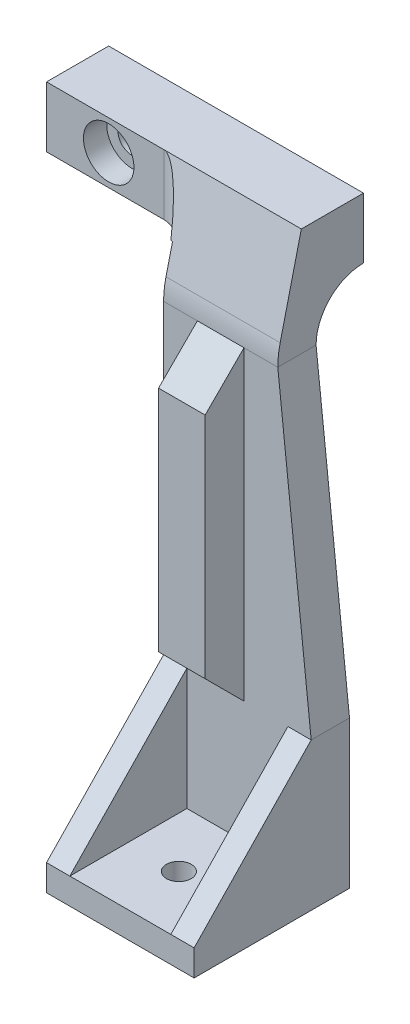
ISO-10303-21;
HEADER;
FILE_DESCRIPTION(('STEP AP214'),'2;1');
FILE_NAME('part.step','',(''),(''),'','','');
FILE_SCHEMA(('AUTOMOTIVE_DESIGN { 1 0 10303 214 1 1 1 1 }'));
ENDSEC;
DATA;
#1=APPLICATION_CONTEXT('core data for automotive mechanical design processes');
#2=APPLICATION_PROTOCOL_DEFINITION('international standard','automotive_design',2000,#1);
#3=PRODUCT_CONTEXT('',#1,'mechanical');
#4=PRODUCT('Part','Part','',(#3));
#5=PRODUCT_RELATED_PRODUCT_CATEGORY('part','',(#4));
#6=PRODUCT_DEFINITION_FORMATION('','',#4);
#7=PRODUCT_DEFINITION_CONTEXT('part definition',#1,'design');
#8=PRODUCT_DEFINITION('design','',#6,#7);
#9=PRODUCT_DEFINITION_SHAPE('','',#8);
#10=(LENGTH_UNIT() NAMED_UNIT(*) SI_UNIT(.MILLI.,.METRE.));
#11=(NAMED_UNIT(*) PLANE_ANGLE_UNIT() SI_UNIT($,.RADIAN.));
#12=(NAMED_UNIT(*) SI_UNIT($,.STERADIAN.) SOLID_ANGLE_UNIT());
#13=UNCERTAINTY_MEASURE_WITH_UNIT(LENGTH_MEASURE(1.E-05),#10,'distance_accuracy_value','');
#14=(GEOMETRIC_REPRESENTATION_CONTEXT(3) GLOBAL_UNCERTAINTY_ASSIGNED_CONTEXT((#13)) GLOBAL_UNIT_ASSIGNED_CONTEXT((#10,
#11,#12)) REPRESENTATION_CONTEXT('',''));
#15=CARTESIAN_POINT('',(0.,0.,0.));
#16=DIRECTION('',(0.,0.,1.));
#17=DIRECTION('',(1.,0.,0.));
#18=AXIS2_PLACEMENT_3D('',#15,#16,#17);
#19=CARTESIAN_POINT('',(-24.8,10.,-6.1));
#20=DIRECTION('',(0.,0.,1.));
#21=DIRECTION('',(1.,0.,0.));
#22=AXIS2_PLACEMENT_3D('',#19,#20,#21);
#23=CYLINDRICAL_SURFACE('',#22,1.8);
#24=CARTESIAN_POINT('',(-24.8,10.,-6.1));
#25=DIRECTION('',(0.,0.,1.));
#26=DIRECTION('',(1.,0.,0.));
#27=AXIS2_PLACEMENT_3D('',#24,#25,#26);
#28=CIRCLE('',#27,1.8);
#29=CARTESIAN_POINT('',(-23.,10.,-6.1));
#30=VERTEX_POINT('',#29);
#31=EDGE_CURVE('E746',#30,#30,#28,.T.);
#32=ORIENTED_EDGE('',*,*,#31,.F.);
#33=EDGE_LOOP('',(#32));
#34=FACE_BOUND('',#33,.T.);
#35=CARTESIAN_POINT('',(-24.8,10.,-1.1));
#36=DIRECTION('',(0.,0.,1.));
#37=DIRECTION('',(1.,0.,0.));
#38=AXIS2_PLACEMENT_3D('',#35,#36,#37);
#39=CIRCLE('',#38,1.8);
#40=CARTESIAN_POINT('',(-23.,10.,-1.1));
#41=VERTEX_POINT('',#40);
#42=EDGE_CURVE('E76',#41,#41,#39,.F.);
#43=ORIENTED_EDGE('',*,*,#42,.F.);
#44=EDGE_LOOP('',(#43));
#45=FACE_BOUND('',#44,.T.);
#46=ADVANCED_FACE('F72',(#34,#45),#23,.F.);
#47=CARTESIAN_POINT('',(0.,0.,1.9));
#48=DIRECTION('',(0.,0.,1.));
#49=DIRECTION('',(1.,0.,0.));
#50=AXIS2_PLACEMENT_3D('',#47,#48,#49);
#51=PLANE('',#50);
#52=CARTESIAN_POINT('',(-24.8,10.,1.9));
#53=DIRECTION('',(0.,0.,1.));
#54=DIRECTION('',(1.,0.,0.));
#55=AXIS2_PLACEMENT_3D('',#52,#53,#54);
#56=CIRCLE('',#55,3.25);
#57=CARTESIAN_POINT('',(-21.55,10.,1.9));
#58=VERTEX_POINT('',#57);
#59=EDGE_CURVE('E742',#58,#58,#56,.T.);
#60=ORIENTED_EDGE('',*,*,#59,.F.);
#61=EDGE_LOOP('',(#60));
#62=FACE_BOUND('',#61,.T.);
#63=DIRECTION('',(-1.,0.,0.));
#64=VECTOR('',#63,1.);
#65=CARTESIAN_POINT('',(0.,6.1,1.9));
#66=LINE('',#65,#64);
#67=CARTESIAN_POINT('',(-17.7,6.1,1.9));
#68=VERTEX_POINT('',#67);
#69=CARTESIAN_POINT('',(-32.8,6.1,1.9));
#70=VERTEX_POINT('',#69);
#71=EDGE_CURVE('E306',#68,#70,#66,.T.);
#72=ORIENTED_EDGE('',*,*,#71,.F.);
#73=DIRECTION('',(0.,-1.,0.));
#74=VECTOR('',#73,1.);
#75=CARTESIAN_POINT('',(-17.7,0.,1.9));
#76=LINE('',#75,#74);
#77=CARTESIAN_POINT('',(-17.7,13.9,1.9));
#78=VERTEX_POINT('',#77);
#79=EDGE_CURVE('E289',#68,#78,#76,.F.);
#80=ORIENTED_EDGE('',*,*,#79,.T.);
#81=DIRECTION('',(1.,0.,0.));
#82=VECTOR('',#81,1.);
#83=CARTESIAN_POINT('',(0.,13.9,1.9));
#84=LINE('',#83,#82);
#85=CARTESIAN_POINT('',(-32.8,13.9,1.9));
#86=VERTEX_POINT('',#85);
#87=EDGE_CURVE('E304',#86,#78,#84,.T.);
#88=ORIENTED_EDGE('',*,*,#87,.F.);
#89=DIRECTION('',(0.,1.,0.));
#90=VECTOR('',#89,1.);
#91=CARTESIAN_POINT('',(-32.8,6.1,1.9));
#92=LINE('',#91,#90);
#93=EDGE_CURVE('E320',#70,#86,#92,.T.);
#94=ORIENTED_EDGE('',*,*,#93,.F.);
#95=EDGE_LOOP('',(#72,#80,#88,#94));
#96=FACE_BOUND('',#95,.T.);
#97=ADVANCED_FACE('F303',(#62,#96),#51,.T.);
#98=CARTESIAN_POINT('',(-14.7,0.,4.93));
#99=DIRECTION('',(1.,0.,0.));
#100=DIRECTION('',(0.,0.,-1.));
#101=AXIS2_PLACEMENT_3D('',#98,#99,#100);
#102=PLANE('',#101);
#103=DIRECTION('',(0.,-0.972246500148864,0.233958848835186));
#104=VECTOR('',#103,1.);
#105=CARTESIAN_POINT('',(-14.7,13.9,1.9));
#106=LINE('',#105,#104);
#107=CARTESIAN_POINT('',(-14.7,6.1,3.77697155056361));
#108=VERTEX_POINT('',#107);
#109=CARTESIAN_POINT('',(-14.7,2.5805661026521,4.62387889664197));
#110=VERTEX_POINT('',#109);
#111=EDGE_CURVE('E215',#108,#110,#106,.T.);
#112=ORIENTED_EDGE('',*,*,#111,.F.);
#113=DIRECTION('',(0.,0.,-1.));
#114=VECTOR('',#113,1.);
#115=CARTESIAN_POINT('',(-14.7,6.1,4.93));
#116=LINE('',#115,#114);
#117=CARTESIAN_POINT('',(-14.7,6.09999999999999,-6.1));
#118=VERTEX_POINT('',#117);
#119=EDGE_CURVE('E333',#108,#118,#116,.T.);
#120=ORIENTED_EDGE('',*,*,#119,.T.);
#121=CARTESIAN_POINT('',(-14.7,0.,-6.1));
#122=DIRECTION('',(1.,0.,0.));
#123=DIRECTION('',(0.,0.,1.));
#124=AXIS2_PLACEMENT_3D('',#121,#122,#123);
#125=CIRCLE('',#124,6.1);
#126=CARTESIAN_POINT('',(-14.7,0.,0.));
#127=VERTEX_POINT('',#126);
#128=EDGE_CURVE('E237',#118,#127,#125,.T.);
#129=ORIENTED_EDGE('',*,*,#128,.T.);
#130=DIRECTION('',(0.,-1.,0.));
#131=VECTOR('',#130,1.);
#132=CARTESIAN_POINT('',(-14.7,0.,0.));
#133=LINE('',#132,#131);
#134=CARTESIAN_POINT('',(-14.7,-58.4008189065249,0.));
#135=VERTEX_POINT('',#134);
#136=EDGE_CURVE('E263',#127,#135,#133,.T.);
#137=ORIENTED_EDGE('',*,*,#136,.T.);
#138=DIRECTION('',(0.,0.,1.));
#139=VECTOR('',#138,1.);
#140=CARTESIAN_POINT('',(-14.7,-58.4008189065249,0.));
#141=LINE('',#140,#139);
#142=CARTESIAN_POINT('',(-14.7,-58.4008189065249,20.));
#143=VERTEX_POINT('',#142);
#144=EDGE_CURVE('E294',#135,#143,#141,.T.);
#145=ORIENTED_EDGE('',*,*,#144,.T.);
#146=DIRECTION('',(0.,1.,0.));
#147=VECTOR('',#146,1.);
#148=CARTESIAN_POINT('',(-14.7,-61.4,20.));
#149=LINE('',#148,#147);
#150=CARTESIAN_POINT('',(-14.7,-55.04,20.));
#151=VERTEX_POINT('',#150);
#152=EDGE_CURVE('E394',#143,#151,#149,.T.);
#153=ORIENTED_EDGE('',*,*,#152,.T.);
#154=DIRECTION('',(0.,0.720107170789403,-0.693862855741451));
#155=VECTOR('',#154,1.);
#156=CARTESIAN_POINT('',(-14.7,-55.04,20.));
#157=LINE('',#156,#155);
#158=CARTESIAN_POINT('',(-14.7,-39.4,4.93));
#159=VERTEX_POINT('',#158);
#160=EDGE_CURVE('E387',#151,#159,#157,.T.);
#161=ORIENTED_EDGE('',*,*,#160,.T.);
#162=DIRECTION('',(0.,-1.,0.));
#163=VECTOR('',#162,1.);
#164=CARTESIAN_POINT('',(-14.7,0.,4.93));
#165=LINE('',#164,#163);
#166=CARTESIAN_POINT('',(-14.7,0.,4.93));
#167=VERTEX_POINT('',#166);
#168=EDGE_CURVE('E240',#167,#159,#165,.T.);
#169=ORIENTED_EDGE('',*,*,#168,.F.);
#170=CARTESIAN_POINT('',(-14.7,0.,-6.1));
#171=DIRECTION('',(-1.,0.,0.));
#172=DIRECTION('',(0.,0.,1.));
#173=AXIS2_PLACEMENT_3D('',#170,#171,#172);
#174=CIRCLE('',#173,11.03);
#175=EDGE_CURVE('E227',#167,#110,#174,.T.);
#176=ORIENTED_EDGE('',*,*,#175,.T.);
#177=EDGE_LOOP('',(#112,#120,#129,#137,#145,#153,#161,#169,#176));
#178=FACE_BOUND('',#177,.T.);
#179=ADVANCED_FACE('F234',(#178),#102,.F.);
#180=CARTESIAN_POINT('',(4.3,-39.4,4.93));
#181=DIRECTION('',(-1.,0.,0.));
#182=DIRECTION('',(0.,-1.,0.));
#183=AXIS2_PLACEMENT_3D('',#180,#181,#182);
#184=PLANE('',#183);
#185=DIRECTION('',(0.,0.,1.));
#186=VECTOR('',#185,1.);
#187=CARTESIAN_POINT('',(4.3,-58.4008189065249,0.));
#188=LINE('',#187,#186);
#189=CARTESIAN_POINT('',(4.3,-58.4008189065249,0.));
#190=VERTEX_POINT('',#189);
#191=CARTESIAN_POINT('',(4.3,-58.4008189065249,20.));
#192=VERTEX_POINT('',#191);
#193=EDGE_CURVE('E338',#190,#192,#188,.T.);
#194=ORIENTED_EDGE('',*,*,#193,.F.);
#195=DIRECTION('',(0.,1.,0.));
#196=VECTOR('',#195,1.);
#197=CARTESIAN_POINT('',(4.3,-39.4,0.));
#198=LINE('',#197,#196);
#199=CARTESIAN_POINT('',(4.3,-39.4,0.));
#200=VERTEX_POINT('',#199);
#201=EDGE_CURVE('E253',#190,#200,#198,.T.);
#202=ORIENTED_EDGE('',*,*,#201,.T.);
#203=DIRECTION('',(0.,0.,-1.));
#204=VECTOR('',#203,1.);
#205=CARTESIAN_POINT('',(4.3,-39.4,4.93));
#206=LINE('',#205,#204);
#207=CARTESIAN_POINT('',(4.3,-39.4,4.93));
#208=VERTEX_POINT('',#207);
#209=EDGE_CURVE('E256',#208,#200,#206,.T.);
#210=ORIENTED_EDGE('',*,*,#209,.F.);
#211=DIRECTION('',(0.,-0.720107170789403,0.693862855741451));
#212=VECTOR('',#211,1.);
#213=CARTESIAN_POINT('',(4.3,-55.04,20.));
#214=LINE('',#213,#212);
#215=CARTESIAN_POINT('',(4.3,-55.04,20.));
#216=VERTEX_POINT('',#215);
#217=EDGE_CURVE('E242',#208,#216,#214,.T.);
#218=ORIENTED_EDGE('',*,*,#217,.T.);
#219=DIRECTION('',(0.,-1.,0.));
#220=VECTOR('',#219,1.);
#221=CARTESIAN_POINT('',(4.3,-61.4,20.));
#222=LINE('',#221,#220);
#223=EDGE_CURVE('E390',#216,#192,#222,.T.);
#224=ORIENTED_EDGE('',*,*,#223,.T.);
#225=EDGE_LOOP('',(#194,#202,#210,#218,#224));
#226=FACE_BOUND('',#225,.T.);
#227=ADVANCED_FACE('F431',(#226),#184,.F.);
#228=CARTESIAN_POINT('',(0.,0.,0.));
#229=DIRECTION('',(0.,0.,-1.));
#230=DIRECTION('',(-1.,0.,0.));
#231=AXIS2_PLACEMENT_3D('',#228,#229,#230);
#232=PLANE('',#231);
#233=ORIENTED_EDGE('',*,*,#201,.F.);
#234=DIRECTION('',(-1.,0.,0.));
#235=VECTOR('',#234,1.);
#236=CARTESIAN_POINT('',(-14.7,-58.4008189065249,0.));
#237=LINE('',#236,#235);
#238=EDGE_CURVE('E340',#190,#135,#237,.T.);
#239=ORIENTED_EDGE('',*,*,#238,.T.);
#240=ORIENTED_EDGE('',*,*,#136,.F.);
#241=DIRECTION('',(-1.,0.,0.));
#242=VECTOR('',#241,1.);
#243=CARTESIAN_POINT('',(0.,0.,0.));
#244=LINE('',#243,#242);
#245=CARTESIAN_POINT('',(0.,0.,0.));
#246=VERTEX_POINT('',#245);
#247=EDGE_CURVE('E265',#246,#127,#244,.T.);
#248=ORIENTED_EDGE('',*,*,#247,.F.);
#249=DIRECTION('',(-0.108492844893712,0.99409722995634,0.));
#250=VECTOR('',#249,1.);
#251=CARTESIAN_POINT('',(0.,0.,0.));
#252=LINE('',#251,#250);
#253=EDGE_CURVE('E252',#200,#246,#252,.T.);
#254=ORIENTED_EDGE('',*,*,#253,.F.);
#255=EDGE_LOOP('',(#233,#239,#240,#248,#254));
#256=FACE_BOUND('',#255,.T.);
#257=ADVANCED_FACE('F437',(#256),#232,.T.);
#258=CARTESIAN_POINT('',(0.,0.,4.93));
#259=DIRECTION('',(0.,0.,-1.));
#260=DIRECTION('',(-1.,0.,0.));
#261=AXIS2_PLACEMENT_3D('',#258,#259,#260);
#262=PLANE('',#261);
#263=DIRECTION('',(0.,-1.,0.));
#264=VECTOR('',#263,1.);
#265=CARTESIAN_POINT('',(-10.35,0.,4.93));
#266=LINE('',#265,#264);
#267=CARTESIAN_POINT('',(-10.35,0.,4.93));
#268=VERTEX_POINT('',#267);
#269=CARTESIAN_POINT('',(-10.35,-39.4,4.93));
#270=VERTEX_POINT('',#269);
#271=EDGE_CURVE('E350',#268,#270,#266,.T.);
#272=ORIENTED_EDGE('',*,*,#271,.F.);
#273=DIRECTION('',(-1.,0.,0.));
#274=VECTOR('',#273,1.);
#275=CARTESIAN_POINT('',(0.,0.,4.93));
#276=LINE('',#275,#274);
#277=EDGE_CURVE('E251',#268,#167,#276,.T.);
#278=ORIENTED_EDGE('',*,*,#277,.T.);
#279=ORIENTED_EDGE('',*,*,#168,.T.);
#280=DIRECTION('',(-1.,0.,0.));
#281=VECTOR('',#280,1.);
#282=CARTESIAN_POINT('',(30.966550208079,-39.4,4.93));
#283=LINE('',#282,#281);
#284=CARTESIAN_POINT('',(-11.7,-39.4,4.93));
#285=VERTEX_POINT('',#284);
#286=EDGE_CURVE('E393',#285,#159,#283,.T.);
#287=ORIENTED_EDGE('',*,*,#286,.F.);
#288=DIRECTION('',(0.,-1.,0.));
#289=VECTOR('',#288,1.);
#290=CARTESIAN_POINT('',(-11.7,-39.4,4.93));
#291=LINE('',#290,#289);
#292=CARTESIAN_POINT('',(-11.7,-55.04,4.93));
#293=VERTEX_POINT('',#292);
#294=EDGE_CURVE('E372',#285,#293,#291,.T.);
#295=ORIENTED_EDGE('',*,*,#294,.T.);
#296=DIRECTION('',(1.,0.,0.));
#297=VECTOR('',#296,1.);
#298=CARTESIAN_POINT('',(-11.7,-55.04,4.93));
#299=LINE('',#298,#297);
#300=CARTESIAN_POINT('',(1.3,-55.04,4.93));
#301=VERTEX_POINT('',#300);
#302=EDGE_CURVE('E380',#293,#301,#299,.T.);
#303=ORIENTED_EDGE('',*,*,#302,.T.);
#304=DIRECTION('',(0.,1.,0.));
#305=VECTOR('',#304,1.);
#306=CARTESIAN_POINT('',(1.3,-39.4,4.93));
#307=LINE('',#306,#305);
#308=CARTESIAN_POINT('',(1.3,-39.4,4.93));
#309=VERTEX_POINT('',#308);
#310=EDGE_CURVE('E379',#301,#309,#307,.T.);
#311=ORIENTED_EDGE('',*,*,#310,.T.);
#312=EDGE_CURVE('E397',#208,#309,#283,.T.);
#313=ORIENTED_EDGE('',*,*,#312,.F.);
#314=DIRECTION('',(-0.108492844893712,0.99409722995634,0.));
#315=VECTOR('',#314,1.);
#316=CARTESIAN_POINT('',(0.,0.,4.93));
#317=LINE('',#316,#315);
#318=CARTESIAN_POINT('',(0.,0.,4.93));
#319=VERTEX_POINT('',#318);
#320=EDGE_CURVE('E255',#208,#319,#317,.T.);
#321=ORIENTED_EDGE('',*,*,#320,.T.);
#322=CARTESIAN_POINT('',(-4.35,0.,4.93));
#323=VERTEX_POINT('',#322);
#324=EDGE_CURVE('E257',#319,#323,#276,.T.);
#325=ORIENTED_EDGE('',*,*,#324,.T.);
#326=DIRECTION('',(0.,1.,0.));
#327=VECTOR('',#326,1.);
#328=CARTESIAN_POINT('',(-4.35000000000001,0.,4.93));
#329=LINE('',#328,#327);
#330=CARTESIAN_POINT('',(-4.34999999999999,-39.4,4.93));
#331=VERTEX_POINT('',#330);
#332=EDGE_CURVE('E363',#331,#323,#329,.T.);
#333=ORIENTED_EDGE('',*,*,#332,.F.);
#334=DIRECTION('',(1.,0.,0.));
#335=VECTOR('',#334,1.);
#336=CARTESIAN_POINT('',(-10.35,-39.4,4.93));
#337=LINE('',#336,#335);
#338=EDGE_CURVE('E356',#270,#331,#337,.T.);
#339=ORIENTED_EDGE('',*,*,#338,.F.);
#340=EDGE_LOOP('',(#272,#278,#279,#287,#295,#303,#311,#313,#321,#325,#333,#339));
#341=FACE_BOUND('',#340,.T.);
#342=ADVANCED_FACE('F414',(#341),#262,.F.);
#343=CARTESIAN_POINT('',(30.966550208079,-55.04,20.));
#344=DIRECTION('',(0.,0.693862855741451,0.720107170789403));
#345=DIRECTION('',(0.,-0.720107170789403,0.693862855741451));
#346=AXIS2_PLACEMENT_3D('',#343,#344,#345);
#347=PLANE('',#346);
#348=DIRECTION('',(0.,-0.720107170789403,0.693862855741451));
#349=VECTOR('',#348,1.);
#350=CARTESIAN_POINT('',(-11.7,-46.9303098183329,12.1858675807082));
#351=LINE('',#350,#349);
#352=CARTESIAN_POINT('',(-11.7,-55.04,20.));
#353=VERTEX_POINT('',#352);
#354=EDGE_CURVE('E371',#285,#353,#351,.T.);
#355=ORIENTED_EDGE('',*,*,#354,.F.);
#356=ORIENTED_EDGE('',*,*,#286,.T.);
#357=ORIENTED_EDGE('',*,*,#160,.F.);
#358=DIRECTION('',(-1.,0.,0.));
#359=VECTOR('',#358,1.);
#360=CARTESIAN_POINT('',(30.966550208079,-55.04,20.));
#361=LINE('',#360,#359);
#362=EDGE_CURVE('E398',#353,#151,#361,.T.);
#363=ORIENTED_EDGE('',*,*,#362,.F.);
#364=EDGE_LOOP('',(#355,#356,#357,#363));
#365=FACE_BOUND('',#364,.T.);
#366=ADVANCED_FACE('F409',(#365),#347,.T.);
#367=CARTESIAN_POINT('',(0.,0.,4.93));
#368=DIRECTION('',(-0.99409722995634,-0.108492844893712,0.));
#369=DIRECTION('',(0.108492844893712,-0.99409722995634,0.));
#370=AXIS2_PLACEMENT_3D('',#367,#368,#369);
#371=PLANE('',#370);
#372=ORIENTED_EDGE('',*,*,#253,.T.);
#373=DIRECTION('',(0.,0.,-1.));
#374=VECTOR('',#373,1.);
#375=CARTESIAN_POINT('',(0.,0.,4.93));
#376=LINE('',#375,#374);
#377=EDGE_CURVE('E272',#319,#246,#376,.T.);
#378=ORIENTED_EDGE('',*,*,#377,.F.);
#379=ORIENTED_EDGE('',*,*,#320,.F.);
#380=ORIENTED_EDGE('',*,*,#209,.T.);
#381=EDGE_LOOP('',(#372,#378,#379,#380));
#382=FACE_BOUND('',#381,.T.);
#383=ADVANCED_FACE('F442',(#382),#371,.F.);
#384=CARTESIAN_POINT('',(0.,0.,-6.1));
#385=DIRECTION('',(-1.,0.,0.));
#386=DIRECTION('',(0.,0.,1.));
#387=AXIS2_PLACEMENT_3D('',#384,#385,#386);
#388=CYLINDRICAL_SURFACE('',#387,6.1);
#389=ORIENTED_EDGE('',*,*,#128,.F.);
#390=DIRECTION('',(-1.,0.,0.));
#391=VECTOR('',#390,1.);
#392=CARTESIAN_POINT('',(0.,6.1,-6.1));
#393=LINE('',#392,#391);
#394=CARTESIAN_POINT('',(0.,6.1,-6.1));
#395=VERTEX_POINT('',#394);
#396=EDGE_CURVE('E247',#395,#118,#393,.T.);
#397=ORIENTED_EDGE('',*,*,#396,.F.);
#398=CARTESIAN_POINT('',(0.,0.,-6.1));
#399=DIRECTION('',(1.,0.,0.));
#400=DIRECTION('',(0.,0.,1.));
#401=AXIS2_PLACEMENT_3D('',#398,#399,#400);
#402=CIRCLE('',#401,6.1);
#403=EDGE_CURVE('E238',#395,#246,#402,.T.);
#404=ORIENTED_EDGE('',*,*,#403,.T.);
#405=ORIENTED_EDGE('',*,*,#247,.T.);
#406=EDGE_LOOP('',(#389,#397,#404,#405));
#407=FACE_BOUND('',#406,.T.);
#408=ADVANCED_FACE('F581',(#407),#388,.F.);
#409=CARTESIAN_POINT('',(0.,0.,-6.1));
#410=DIRECTION('',(-1.,0.,0.));
#411=DIRECTION('',(0.,0.,1.));
#412=AXIS2_PLACEMENT_3D('',#409,#410,#411);
#413=CYLINDRICAL_SURFACE('',#412,11.03);
#414=DIRECTION('',(1.,0.,0.));
#415=VECTOR('',#414,1.);
#416=CARTESIAN_POINT('',(-14.7,2.5805661026521,4.62387889664197));
#417=LINE('',#416,#415);
#418=CARTESIAN_POINT('',(0.,2.5805661026521,4.62387889664197));
#419=VERTEX_POINT('',#418);
#420=EDGE_CURVE('E211',#110,#419,#417,.T.);
#421=ORIENTED_EDGE('',*,*,#420,.F.);
#422=ORIENTED_EDGE('',*,*,#175,.F.);
#423=ORIENTED_EDGE('',*,*,#277,.F.);
#424=DIRECTION('',(-1.,0.,0.));
#425=VECTOR('',#424,1.);
#426=CARTESIAN_POINT('',(-10.35,0.,4.93));
#427=LINE('',#426,#425);
#428=EDGE_CURVE('E355',#323,#268,#427,.T.);
#429=ORIENTED_EDGE('',*,*,#428,.F.);
#430=ORIENTED_EDGE('',*,*,#324,.F.);
#431=CARTESIAN_POINT('',(0.,0.,-6.1));
#432=DIRECTION('',(-1.,0.,0.));
#433=DIRECTION('',(0.,0.,1.));
#434=AXIS2_PLACEMENT_3D('',#431,#432,#433);
#435=CIRCLE('',#434,11.03);
#436=EDGE_CURVE('E229',#319,#419,#435,.T.);
#437=ORIENTED_EDGE('',*,*,#436,.T.);
#438=EDGE_LOOP('',(#421,#422,#423,#429,#430,#437));
#439=FACE_BOUND('',#438,.T.);
#440=ADVANCED_FACE('F224',(#439),#413,.T.);
#441=CARTESIAN_POINT('',(0.,0.,-6.1));
#442=DIRECTION('',(-1.,0.,0.));
#443=DIRECTION('',(0.,0.,1.));
#444=AXIS2_PLACEMENT_3D('',#441,#442,#443);
#445=PLANE('',#444);
#446=DIRECTION('',(0.,1.,0.));
#447=VECTOR('',#446,1.);
#448=CARTESIAN_POINT('',(0.,0.,-6.1));
#449=LINE('',#448,#447);
#450=CARTESIAN_POINT('',(0.,13.9,-6.1));
#451=VERTEX_POINT('',#450);
#452=EDGE_CURVE('E288',#395,#451,#449,.T.);
#453=ORIENTED_EDGE('',*,*,#452,.T.);
#454=DIRECTION('',(0.,0.,-1.));
#455=VECTOR('',#454,1.);
#456=CARTESIAN_POINT('',(0.,13.9,1.9));
#457=LINE('',#456,#455);
#458=CARTESIAN_POINT('',(0.,13.9,1.9));
#459=VERTEX_POINT('',#458);
#460=EDGE_CURVE('E331',#459,#451,#457,.T.);
#461=ORIENTED_EDGE('',*,*,#460,.F.);
#462=DIRECTION('',(0.,-0.972246500148864,0.233958848835186));
#463=VECTOR('',#462,1.);
#464=CARTESIAN_POINT('',(0.,13.9,1.9));
#465=LINE('',#464,#463);
#466=EDGE_CURVE('E218',#459,#419,#465,.T.);
#467=ORIENTED_EDGE('',*,*,#466,.T.);
#468=ORIENTED_EDGE('',*,*,#436,.F.);
#469=ORIENTED_EDGE('',*,*,#377,.T.);
#470=ORIENTED_EDGE('',*,*,#403,.F.);
#471=EDGE_LOOP('',(#453,#461,#467,#468,#469,#470));
#472=FACE_BOUND('',#471,.T.);
#473=ADVANCED_FACE('F601',(#472),#445,.F.);
#474=DIRECTION('',(0.,0.720107170789403,-0.693862855741451));
#475=VECTOR('',#474,1.);
#476=CARTESIAN_POINT('',(1.3,-46.9303098183329,12.1858675807082));
#477=LINE('',#476,#475);
#478=CARTESIAN_POINT('',(1.3,-55.04,20.));
#479=VERTEX_POINT('',#478);
#480=EDGE_CURVE('E368',#479,#309,#477,.T.);
#481=ORIENTED_EDGE('',*,*,#480,.F.);
#482=EDGE_CURVE('E386',#216,#479,#361,.T.);
#483=ORIENTED_EDGE('',*,*,#482,.F.);
#484=ORIENTED_EDGE('',*,*,#217,.F.);
#485=ORIENTED_EDGE('',*,*,#312,.T.);
#486=EDGE_LOOP('',(#481,#483,#484,#485));
#487=FACE_BOUND('',#486,.T.);
#488=ADVANCED_FACE('F430',(#487),#347,.T.);
#489=CARTESIAN_POINT('',(30.966550208079,-61.4,20.));
#490=DIRECTION('',(0.,0.,1.));
#491=DIRECTION('',(1.,0.,0.));
#492=AXIS2_PLACEMENT_3D('',#489,#490,#491);
#493=PLANE('',#492);
#494=DIRECTION('',(-1.,0.,0.));
#495=VECTOR('',#494,1.);
#496=CARTESIAN_POINT('',(-14.7,-58.4008189065249,20.));
#497=LINE('',#496,#495);
#498=EDGE_CURVE('E337',#192,#143,#497,.T.);
#499=ORIENTED_EDGE('',*,*,#498,.F.);
#500=ORIENTED_EDGE('',*,*,#223,.F.);
#501=ORIENTED_EDGE('',*,*,#482,.T.);
#502=DIRECTION('',(-1.,0.,0.));
#503=VECTOR('',#502,1.);
#504=CARTESIAN_POINT('',(30.966550208079,-55.04,20.));
#505=LINE('',#504,#503);
#506=EDGE_CURVE('E354',#479,#353,#505,.T.);
#507=ORIENTED_EDGE('',*,*,#506,.T.);
#508=ORIENTED_EDGE('',*,*,#362,.T.);
#509=ORIENTED_EDGE('',*,*,#152,.F.);
#510=EDGE_LOOP('',(#499,#500,#501,#507,#508,#509));
#511=FACE_BOUND('',#510,.T.);
#512=ADVANCED_FACE('F420',(#511),#493,.T.);
#513=CARTESIAN_POINT('',(-11.7,-39.4,20.001));
#514=DIRECTION('',(1.,0.,0.));
#515=DIRECTION('',(0.,1.,0.));
#516=AXIS2_PLACEMENT_3D('',#513,#514,#515);
#517=PLANE('',#516);
#518=ORIENTED_EDGE('',*,*,#354,.T.);
#519=DIRECTION('',(0.,0.,-1.));
#520=VECTOR('',#519,1.);
#521=CARTESIAN_POINT('',(-11.7,-55.04,20.001));
#522=LINE('',#521,#520);
#523=EDGE_CURVE('E381',#353,#293,#522,.T.);
#524=ORIENTED_EDGE('',*,*,#523,.T.);
#525=ORIENTED_EDGE('',*,*,#294,.F.);
#526=EDGE_LOOP('',(#518,#524,#525));
#527=FACE_BOUND('',#526,.T.);
#528=ADVANCED_FACE('F447',(#527),#517,.T.);
#529=CARTESIAN_POINT('',(-11.7,-55.04,20.001));
#530=DIRECTION('',(0.,1.,0.));
#531=DIRECTION('',(0.,0.,1.));
#532=AXIS2_PLACEMENT_3D('',#529,#530,#531);
#533=PLANE('',#532);
#534=CARTESIAN_POINT('',(-5.2,-55.04,12.465));
#535=DIRECTION('',(0.,1.,0.));
#536=DIRECTION('',(0.,0.,1.));
#537=AXIS2_PLACEMENT_3D('',#534,#535,#536);
#538=CIRCLE('',#537,1.6);
#539=CARTESIAN_POINT('',(-5.2,-55.04,14.065));
#540=VERTEX_POINT('',#539);
#541=EDGE_CURVE('E295',#540,#540,#538,.T.);
#542=ORIENTED_EDGE('',*,*,#541,.F.);
#543=EDGE_LOOP('',(#542));
#544=FACE_BOUND('',#543,.T.);
#545=ORIENTED_EDGE('',*,*,#506,.F.);
#546=DIRECTION('',(0.,0.,-1.));
#547=VECTOR('',#546,1.);
#548=CARTESIAN_POINT('',(1.3,-55.04,20.001));
#549=LINE('',#548,#547);
#550=EDGE_CURVE('E385',#479,#301,#549,.T.);
#551=ORIENTED_EDGE('',*,*,#550,.T.);
#552=ORIENTED_EDGE('',*,*,#302,.F.);
#553=ORIENTED_EDGE('',*,*,#523,.F.);
#554=EDGE_LOOP('',(#545,#551,#552,#553));
#555=FACE_BOUND('',#554,.T.);
#556=ADVANCED_FACE('F422',(#544,#555),#533,.T.);
#557=CARTESIAN_POINT('',(1.3,-39.4,20.001));
#558=DIRECTION('',(-1.,0.,0.));
#559=DIRECTION('',(0.,-1.,0.));
#560=AXIS2_PLACEMENT_3D('',#557,#558,#559);
#561=PLANE('',#560);
#562=ORIENTED_EDGE('',*,*,#480,.T.);
#563=ORIENTED_EDGE('',*,*,#310,.F.);
#564=ORIENTED_EDGE('',*,*,#550,.F.);
#565=EDGE_LOOP('',(#562,#563,#564));
#566=FACE_BOUND('',#565,.T.);
#567=ADVANCED_FACE('F428',(#566),#561,.T.);
#568=CARTESIAN_POINT('',(-10.35,0.,9.93));
#569=DIRECTION('',(1.,0.,0.));
#570=DIRECTION('',(0.,1.,0.));
#571=AXIS2_PLACEMENT_3D('',#568,#569,#570);
#572=PLANE('',#571);
#573=ORIENTED_EDGE('',*,*,#271,.T.);
#574=DIRECTION('',(0.,0.707106781186546,0.70710678118655));
#575=VECTOR('',#574,1.);
#576=CARTESIAN_POINT('',(-10.35,-34.4,9.93));
#577=LINE('',#576,#575);
#578=CARTESIAN_POINT('',(-10.35,-34.4,9.93));
#579=VERTEX_POINT('',#578);
#580=EDGE_CURVE('E286',#270,#579,#577,.T.);
#581=ORIENTED_EDGE('',*,*,#580,.T.);
#582=DIRECTION('',(0.,-1.,0.));
#583=VECTOR('',#582,1.);
#584=CARTESIAN_POINT('',(-10.35,0.,9.93));
#585=LINE('',#584,#583);
#586=CARTESIAN_POINT('',(-10.35,-4.99999999999999,9.93));
#587=VERTEX_POINT('',#586);
#588=EDGE_CURVE('E349',#587,#579,#585,.T.);
#589=ORIENTED_EDGE('',*,*,#588,.F.);
#590=DIRECTION('',(0.,0.707106781186548,-0.707106781186548));
#591=VECTOR('',#590,1.);
#592=CARTESIAN_POINT('',(-10.35,-4.99999999999999,9.93));
#593=LINE('',#592,#591);
#594=EDGE_CURVE('E281',#587,#268,#593,.T.);
#595=ORIENTED_EDGE('',*,*,#594,.T.);
#596=EDGE_LOOP('',(#573,#581,#589,#595));
#597=FACE_BOUND('',#596,.T.);
#598=ADVANCED_FACE('F505',(#597),#572,.F.);
#599=CARTESIAN_POINT('',(-4.35000000000001,0.,9.93));
#600=DIRECTION('',(-1.,0.,0.));
#601=DIRECTION('',(0.,-1.,0.));
#602=AXIS2_PLACEMENT_3D('',#599,#600,#601);
#603=PLANE('',#602);
#604=DIRECTION('',(0.,1.,0.));
#605=VECTOR('',#604,1.);
#606=CARTESIAN_POINT('',(-4.35000000000001,0.,9.93));
#607=LINE('',#606,#605);
#608=CARTESIAN_POINT('',(-4.34999999999999,-34.4,9.93));
#609=VERTEX_POINT('',#608);
#610=CARTESIAN_POINT('',(-4.35,-4.99999999999999,9.93));
#611=VERTEX_POINT('',#610);
#612=EDGE_CURVE('E351',#609,#611,#607,.T.);
#613=ORIENTED_EDGE('',*,*,#612,.F.);
#614=DIRECTION('',(0.,-0.707106781186546,-0.70710678118655));
#615=VECTOR('',#614,1.);
#616=CARTESIAN_POINT('',(-4.34999999999999,-34.4,9.93));
#617=LINE('',#616,#615);
#618=EDGE_CURVE('E285',#609,#331,#617,.T.);
#619=ORIENTED_EDGE('',*,*,#618,.T.);
#620=ORIENTED_EDGE('',*,*,#332,.T.);
#621=DIRECTION('',(0.,-0.707106781186548,0.707106781186548));
#622=VECTOR('',#621,1.);
#623=CARTESIAN_POINT('',(-4.35,-4.99999999999999,9.93));
#624=LINE('',#623,#622);
#625=EDGE_CURVE('E276',#323,#611,#624,.T.);
#626=ORIENTED_EDGE('',*,*,#625,.T.);
#627=EDGE_LOOP('',(#613,#619,#620,#626));
#628=FACE_BOUND('',#627,.T.);
#629=ADVANCED_FACE('F498',(#628),#603,.F.);
#630=CARTESIAN_POINT('',(0.,0.,9.93));
#631=DIRECTION('',(0.,0.,1.));
#632=DIRECTION('',(1.,0.,0.));
#633=AXIS2_PLACEMENT_3D('',#630,#631,#632);
#634=PLANE('',#633);
#635=ORIENTED_EDGE('',*,*,#588,.T.);
#636=DIRECTION('',(1.,0.,0.));
#637=VECTOR('',#636,1.);
#638=CARTESIAN_POINT('',(-4.34999999999999,-34.4,9.93));
#639=LINE('',#638,#637);
#640=EDGE_CURVE('E280',#579,#609,#639,.T.);
#641=ORIENTED_EDGE('',*,*,#640,.T.);
#642=ORIENTED_EDGE('',*,*,#612,.T.);
#643=DIRECTION('',(-1.,0.,0.));
#644=VECTOR('',#643,1.);
#645=CARTESIAN_POINT('',(-10.35,-4.99999999999999,9.93));
#646=LINE('',#645,#644);
#647=EDGE_CURVE('E274',#611,#587,#646,.T.);
#648=ORIENTED_EDGE('',*,*,#647,.T.);
#649=EDGE_LOOP('',(#635,#641,#642,#648));
#650=FACE_BOUND('',#649,.T.);
#651=ADVANCED_FACE('F494',(#650),#634,.T.);
#652=CARTESIAN_POINT('',(0.,-34.4,9.93));
#653=DIRECTION('',(0.,-0.707106781186549,0.707106781186545));
#654=DIRECTION('',(-1.,0.,0.));
#655=AXIS2_PLACEMENT_3D('',#652,#653,#654);
#656=PLANE('',#655);
#657=ORIENTED_EDGE('',*,*,#580,.F.);
#658=ORIENTED_EDGE('',*,*,#338,.T.);
#659=ORIENTED_EDGE('',*,*,#618,.F.);
#660=ORIENTED_EDGE('',*,*,#640,.F.);
#661=EDGE_LOOP('',(#657,#658,#659,#660));
#662=FACE_BOUND('',#661,.T.);
#663=ADVANCED_FACE('F500',(#662),#656,.T.);
#664=CARTESIAN_POINT('',(0.,-4.99999999999999,9.93));
#665=DIRECTION('',(0.,0.707106781186547,0.707106781186547));
#666=DIRECTION('',(1.,0.,0.));
#667=AXIS2_PLACEMENT_3D('',#664,#665,#666);
#668=PLANE('',#667);
#669=ORIENTED_EDGE('',*,*,#625,.F.);
#670=ORIENTED_EDGE('',*,*,#428,.T.);
#671=ORIENTED_EDGE('',*,*,#594,.F.);
#672=ORIENTED_EDGE('',*,*,#647,.F.);
#673=EDGE_LOOP('',(#669,#670,#671,#672));
#674=FACE_BOUND('',#673,.T.);
#675=ADVANCED_FACE('F495',(#674),#668,.T.);
#676=CARTESIAN_POINT('',(-5.2,-61.401,12.465));
#677=DIRECTION('',(0.,1.,0.));
#678=DIRECTION('',(0.,0.,1.));
#679=AXIS2_PLACEMENT_3D('',#676,#677,#678);
#680=CYLINDRICAL_SURFACE('',#679,1.6);
#681=CARTESIAN_POINT('',(-5.2,-58.4008189065249,12.465));
#682=DIRECTION('',(0.,1.,0.));
#683=DIRECTION('',(0.,0.,1.));
#684=AXIS2_PLACEMENT_3D('',#681,#682,#683);
#685=CIRCLE('',#684,1.6);
#686=CARTESIAN_POINT('',(-5.2,-58.4008189065249,14.065));
#687=VERTEX_POINT('',#686);
#688=EDGE_CURVE('E293',#687,#687,#685,.F.);
#689=ORIENTED_EDGE('',*,*,#688,.T.);
#690=EDGE_LOOP('',(#689));
#691=FACE_BOUND('',#690,.T.);
#692=ORIENTED_EDGE('',*,*,#541,.T.);
#693=EDGE_LOOP('',(#692));
#694=FACE_BOUND('',#693,.T.);
#695=ADVANCED_FACE('F490',(#691,#694),#680,.F.);
#696=CARTESIAN_POINT('',(-14.7,-58.4008189065249,0.));
#697=DIRECTION('',(0.,1.,0.));
#698=DIRECTION('',(0.,0.,1.));
#699=AXIS2_PLACEMENT_3D('',#696,#697,#698);
#700=PLANE('',#699);
#701=ORIENTED_EDGE('',*,*,#498,.T.);
#702=ORIENTED_EDGE('',*,*,#144,.F.);
#703=ORIENTED_EDGE('',*,*,#238,.F.);
#704=ORIENTED_EDGE('',*,*,#193,.T.);
#705=EDGE_LOOP('',(#701,#702,#703,#704));
#706=FACE_BOUND('',#705,.T.);
#707=ORIENTED_EDGE('',*,*,#688,.F.);
#708=EDGE_LOOP('',(#707));
#709=FACE_BOUND('',#708,.T.);
#710=ADVANCED_FACE('F432',(#706,#709),#700,.F.);
#711=CARTESIAN_POINT('',(0.,0.,-6.1));
#712=DIRECTION('',(0.,0.,1.));
#713=DIRECTION('',(1.,0.,0.));
#714=AXIS2_PLACEMENT_3D('',#711,#712,#713);
#715=PLANE('',#714);
#716=ORIENTED_EDGE('',*,*,#31,.T.);
#717=EDGE_LOOP('',(#716));
#718=FACE_BOUND('',#717,.T.);
#719=ORIENTED_EDGE('',*,*,#396,.T.);
#720=DIRECTION('',(-1.,0.,0.));
#721=VECTOR('',#720,1.);
#722=CARTESIAN_POINT('',(0.,6.1,-6.1));
#723=LINE('',#722,#721);
#724=CARTESIAN_POINT('',(-32.8,6.1,-6.1));
#725=VERTEX_POINT('',#724);
#726=EDGE_CURVE('E233',#118,#725,#723,.T.);
#727=ORIENTED_EDGE('',*,*,#726,.T.);
#728=DIRECTION('',(0.,1.,0.));
#729=VECTOR('',#728,1.);
#730=CARTESIAN_POINT('',(-32.8,6.1,-6.1));
#731=LINE('',#730,#729);
#732=CARTESIAN_POINT('',(-32.8,13.9,-6.1));
#733=VERTEX_POINT('',#732);
#734=EDGE_CURVE('E321',#725,#733,#731,.T.);
#735=ORIENTED_EDGE('',*,*,#734,.T.);
#736=DIRECTION('',(1.,0.,0.));
#737=VECTOR('',#736,1.);
#738=CARTESIAN_POINT('',(0.,13.9,-6.1));
#739=LINE('',#738,#737);
#740=EDGE_CURVE('E329',#733,#451,#739,.T.);
#741=ORIENTED_EDGE('',*,*,#740,.T.);
#742=ORIENTED_EDGE('',*,*,#452,.F.);
#743=EDGE_LOOP('',(#719,#727,#735,#741,#742));
#744=FACE_BOUND('',#743,.T.);
#745=ADVANCED_FACE('F482',(#718,#744),#715,.F.);
#746=CARTESIAN_POINT('',(0.,6.1,1.9));
#747=DIRECTION('',(0.,-1.,0.));
#748=DIRECTION('',(0.,0.,-1.));
#749=AXIS2_PLACEMENT_3D('',#746,#747,#748);
#750=PLANE('',#749);
#751=ORIENTED_EDGE('',*,*,#119,.F.);
#752=DIRECTION('',(1.,0.,0.));
#753=VECTOR('',#752,1.);
#754=CARTESIAN_POINT('',(-14.7,6.1,3.77697155056361));
#755=LINE('',#754,#753);
#756=CARTESIAN_POINT('',(-14.918128848822,6.1,3.77697155056361));
#757=VERTEX_POINT('',#756);
#758=EDGE_CURVE('E14',#108,#757,#755,.F.);
#759=ORIENTED_EDGE('',*,*,#758,.T.);
#760=CARTESIAN_POINT('',(-17.7,6.1,4.9));
#761=DIRECTION('',(0.,-1.,0.));
#762=DIRECTION('',(0.,0.,-1.));
#763=AXIS2_PLACEMENT_3D('',#760,#761,#762);
#764=CIRCLE('',#763,3.);
#765=EDGE_CURVE('E83',#757,#68,#764,.F.);
#766=ORIENTED_EDGE('',*,*,#765,.T.);
#767=ORIENTED_EDGE('',*,*,#71,.T.);
#768=DIRECTION('',(0.,0.,-1.));
#769=VECTOR('',#768,1.);
#770=CARTESIAN_POINT('',(-32.8,6.1,1.9));
#771=LINE('',#770,#769);
#772=EDGE_CURVE('E317',#70,#725,#771,.T.);
#773=ORIENTED_EDGE('',*,*,#772,.T.);
#774=ORIENTED_EDGE('',*,*,#726,.F.);
#775=EDGE_LOOP('',(#751,#759,#766,#767,#773,#774));
#776=FACE_BOUND('',#775,.T.);
#777=ADVANCED_FACE('F479',(#776),#750,.T.);
#778=CARTESIAN_POINT('',(0.,13.9,1.9));
#779=DIRECTION('',(0.,1.,0.));
#780=DIRECTION('',(0.,0.,1.));
#781=AXIS2_PLACEMENT_3D('',#778,#779,#780);
#782=PLANE('',#781);
#783=ORIENTED_EDGE('',*,*,#740,.F.);
#784=DIRECTION('',(0.,0.,-1.));
#785=VECTOR('',#784,1.);
#786=CARTESIAN_POINT('',(-32.8,13.9,1.9));
#787=LINE('',#786,#785);
#788=EDGE_CURVE('E313',#86,#733,#787,.T.);
#789=ORIENTED_EDGE('',*,*,#788,.F.);
#790=ORIENTED_EDGE('',*,*,#87,.T.);
#791=DIRECTION('',(1.,0.,0.));
#792=VECTOR('',#791,1.);
#793=CARTESIAN_POINT('',(-14.7,13.9,1.9));
#794=LINE('',#793,#792);
#795=EDGE_CURVE('E216',#78,#459,#794,.T.);
#796=ORIENTED_EDGE('',*,*,#795,.T.);
#797=ORIENTED_EDGE('',*,*,#460,.T.);
#798=EDGE_LOOP('',(#783,#789,#790,#796,#797));
#799=FACE_BOUND('',#798,.T.);
#800=ADVANCED_FACE('F311',(#799),#782,.T.);
#801=CARTESIAN_POINT('',(-32.8,6.1,1.9));
#802=DIRECTION('',(-1.,0.,0.));
#803=DIRECTION('',(0.,0.,1.));
#804=AXIS2_PLACEMENT_3D('',#801,#802,#803);
#805=PLANE('',#804);
#806=ORIENTED_EDGE('',*,*,#734,.F.);
#807=ORIENTED_EDGE('',*,*,#772,.F.);
#808=ORIENTED_EDGE('',*,*,#93,.T.);
#809=ORIENTED_EDGE('',*,*,#788,.T.);
#810=EDGE_LOOP('',(#806,#807,#808,#809));
#811=FACE_BOUND('',#810,.T.);
#812=ADVANCED_FACE('F474',(#811),#805,.T.);
#813=CARTESIAN_POINT('',(-14.7,13.9,1.9));
#814=DIRECTION('',(0.,0.233958848835186,0.972246500148864));
#815=DIRECTION('',(0.,-0.972246500148864,0.233958848835186));
#816=AXIS2_PLACEMENT_3D('',#813,#814,#815);
#817=PLANE('',#816);
#818=ORIENTED_EDGE('',*,*,#466,.F.);
#819=ORIENTED_EDGE('',*,*,#795,.F.);
#820=CARTESIAN_POINT('',(-17.7,1.43310885667203,4.9));
#821=DIRECTION('',(0.,0.233958848835186,0.972246500148864));
#822=DIRECTION('',(0.,-0.972246500148864,0.233958848835186));
#823=AXIS2_PLACEMENT_3D('',#820,#821,#822);
#824=ELLIPSE('',#823,12.822767828343,3.);
#825=EDGE_CURVE('E88',#78,#757,#824,.F.);
#826=ORIENTED_EDGE('',*,*,#825,.T.);
#827=ORIENTED_EDGE('',*,*,#758,.F.);
#828=ORIENTED_EDGE('',*,*,#111,.T.);
#829=ORIENTED_EDGE('',*,*,#420,.T.);
#830=EDGE_LOOP('',(#818,#819,#826,#827,#828,#829));
#831=FACE_BOUND('',#830,.T.);
#832=ADVANCED_FACE('F214',(#831),#817,.T.);
#833=CARTESIAN_POINT('',(-17.7,0.,4.9));
#834=DIRECTION('',(0.,-1.,0.));
#835=DIRECTION('',(0.,0.,-1.));
#836=AXIS2_PLACEMENT_3D('',#833,#834,#835);
#837=CYLINDRICAL_SURFACE('',#836,3.);
#838=ORIENTED_EDGE('',*,*,#825,.F.);
#839=ORIENTED_EDGE('',*,*,#79,.F.);
#840=ORIENTED_EDGE('',*,*,#765,.F.);
#841=EDGE_LOOP('',(#838,#839,#840));
#842=FACE_BOUND('',#841,.T.);
#843=ADVANCED_FACE('F77',(#842),#837,.F.);
#844=CARTESIAN_POINT('',(-24.8,10.,-1.1));
#845=DIRECTION('',(0.,0.,1.));
#846=DIRECTION('',(1.,0.,0.));
#847=AXIS2_PLACEMENT_3D('',#844,#845,#846);
#848=PLANE('',#847);
#849=CARTESIAN_POINT('',(-24.8,10.,-1.1));
#850=DIRECTION('',(0.,0.,1.));
#851=DIRECTION('',(1.,0.,0.));
#852=AXIS2_PLACEMENT_3D('',#849,#850,#851);
#853=CIRCLE('',#852,3.25);
#854=CARTESIAN_POINT('',(-21.55,10.,-1.1));
#855=VERTEX_POINT('',#854);
#856=EDGE_CURVE('E741',#855,#855,#853,.T.);
#857=ORIENTED_EDGE('',*,*,#856,.T.);
#858=EDGE_LOOP('',(#857));
#859=FACE_BOUND('',#858,.T.);
#860=ORIENTED_EDGE('',*,*,#42,.T.);
#861=EDGE_LOOP('',(#860));
#862=FACE_BOUND('',#861,.T.);
#863=ADVANCED_FACE('F644',(#859,#862),#848,.T.);
#864=CARTESIAN_POINT('',(-24.8,10.,-1.1));
#865=DIRECTION('',(0.,0.,1.));
#866=DIRECTION('',(1.,0.,0.));
#867=AXIS2_PLACEMENT_3D('',#864,#865,#866);
#868=CYLINDRICAL_SURFACE('',#867,3.25);
#869=ORIENTED_EDGE('',*,*,#856,.F.);
#870=EDGE_LOOP('',(#869));
#871=FACE_BOUND('',#870,.T.);
#872=ORIENTED_EDGE('',*,*,#59,.T.);
#873=EDGE_LOOP('',(#872));
#874=FACE_BOUND('',#873,.T.);
#875=ADVANCED_FACE('F472',(#871,#874),#868,.F.);
#876=CLOSED_SHELL('',(#46,#97,#179,#227,#257,#342,#366,#383,#408,#440,#473,#488,#512,#528,#556,
#567,#598,#629,#651,#663,#675,#695,#710,#745,#777,#800,#812,#832,#843,#863,#875));
#877=MANIFOLD_SOLID_BREP('B2',#876);
#878=ADVANCED_BREP_SHAPE_REPRESENTATION('',(#18,#877),#14);
#879=SHAPE_DEFINITION_REPRESENTATION(#9,#878);
ENDSEC;
END-ISO-10303-21;
